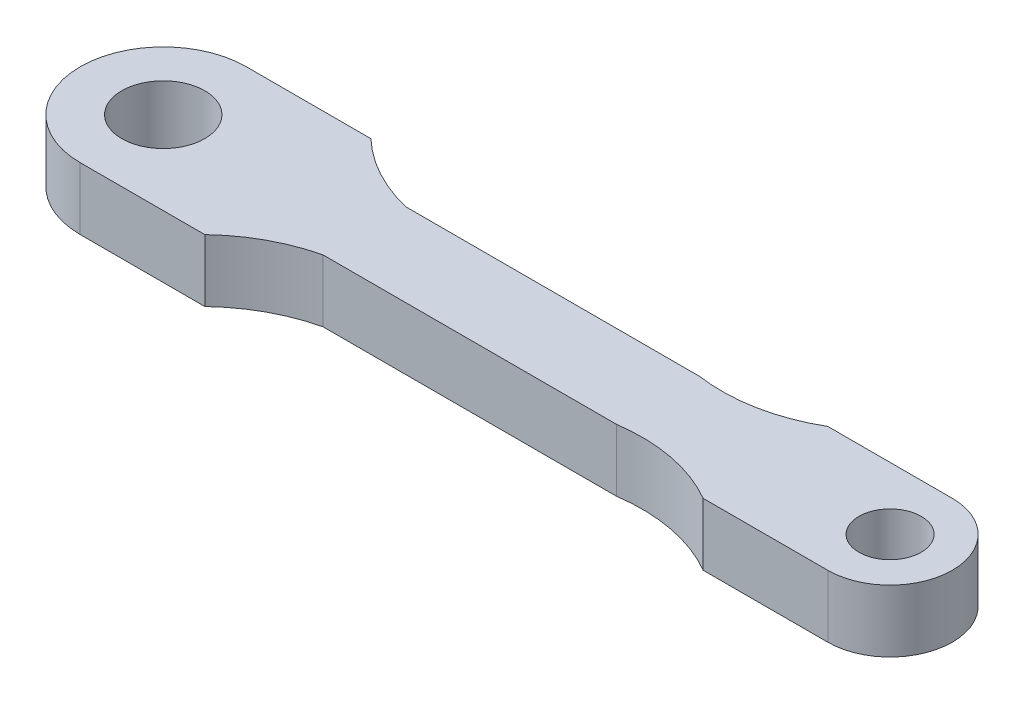
ISO-10303-21;
HEADER;
FILE_DESCRIPTION(('STEP AP214'),'2;1');
FILE_NAME('part.step','',(''),(''),'','','');
FILE_SCHEMA(('AUTOMOTIVE_DESIGN { 1 0 10303 214 1 1 1 1 }'));
ENDSEC;
DATA;
#1=APPLICATION_CONTEXT('core data for automotive mechanical design processes');
#2=APPLICATION_PROTOCOL_DEFINITION('international standard','automotive_design',2000,#1);
#3=PRODUCT_CONTEXT('',#1,'mechanical');
#4=PRODUCT('Part','Part','',(#3));
#5=PRODUCT_RELATED_PRODUCT_CATEGORY('part','',(#4));
#6=PRODUCT_DEFINITION_FORMATION('','',#4);
#7=PRODUCT_DEFINITION_CONTEXT('part definition',#1,'design');
#8=PRODUCT_DEFINITION('design','',#6,#7);
#9=PRODUCT_DEFINITION_SHAPE('','',#8);
#10=(LENGTH_UNIT() NAMED_UNIT(*) SI_UNIT(.MILLI.,.METRE.));
#11=(NAMED_UNIT(*) PLANE_ANGLE_UNIT() SI_UNIT($,.RADIAN.));
#12=(NAMED_UNIT(*) SI_UNIT($,.STERADIAN.) SOLID_ANGLE_UNIT());
#13=UNCERTAINTY_MEASURE_WITH_UNIT(LENGTH_MEASURE(1.E-05),#10,'distance_accuracy_value','');
#14=(GEOMETRIC_REPRESENTATION_CONTEXT(3) GLOBAL_UNCERTAINTY_ASSIGNED_CONTEXT((#13)) GLOBAL_UNIT_ASSIGNED_CONTEXT((#10,
#11,#12)) REPRESENTATION_CONTEXT('',''));
#15=CARTESIAN_POINT('',(0.,0.,0.));
#16=DIRECTION('',(0.,0.,1.));
#17=DIRECTION('',(1.,0.,0.));
#18=AXIS2_PLACEMENT_3D('',#15,#16,#17);
#19=CARTESIAN_POINT('',(-17.5,1.5,0.));
#20=DIRECTION('',(0.,1.,0.));
#21=DIRECTION('',(0.,0.,1.));
#22=AXIS2_PLACEMENT_3D('',#19,#20,#21);
#23=PLANE('',#22);
#24=CARTESIAN_POINT('',(17.5,1.5,0.));
#25=DIRECTION('',(0.,1.,0.));
#26=DIRECTION('',(0.,0.,1.));
#27=AXIS2_PLACEMENT_3D('',#24,#25,#26);
#28=CIRCLE('',#27,1.5);
#29=CARTESIAN_POINT('',(17.5,1.5,1.5));
#30=VERTEX_POINT('',#29);
#31=EDGE_CURVE('E162',#30,#30,#28,.T.);
#32=ORIENTED_EDGE('',*,*,#31,.F.);
#33=EDGE_LOOP('',(#32));
#34=FACE_BOUND('',#33,.T.);
#35=CARTESIAN_POINT('',(-17.5,1.5,0.));
#36=DIRECTION('',(0.,1.,0.));
#37=DIRECTION('',(0.,0.,1.));
#38=AXIS2_PLACEMENT_3D('',#35,#36,#37);
#39=CIRCLE('',#38,4.);
#40=CARTESIAN_POINT('',(-17.5,1.5,-4.));
#41=VERTEX_POINT('',#40);
#42=CARTESIAN_POINT('',(-17.5,1.5,4.));
#43=VERTEX_POINT('',#42);
#44=EDGE_CURVE('E181',#41,#43,#39,.T.);
#45=ORIENTED_EDGE('',*,*,#44,.T.);
#46=DIRECTION('',(1.,0.,0.));
#47=VECTOR('',#46,1.);
#48=CARTESIAN_POINT('',(-17.5,1.5,4.));
#49=LINE('',#48,#47);
#50=CARTESIAN_POINT('',(-11.5,1.5,4.));
#51=VERTEX_POINT('',#50);
#52=EDGE_CURVE('E109',#43,#51,#49,.T.);
#53=ORIENTED_EDGE('',*,*,#52,.T.);
#54=CARTESIAN_POINT('',(-5.97725824612509,1.5,9.78786001212941));
#55=DIRECTION('',(0.,-1.,0.));
#56=DIRECTION('',(0.,0.,-1.));
#57=AXIS2_PLACEMENT_3D('',#54,#55,#56);
#58=CIRCLE('',#57,8.);
#59=CARTESIAN_POINT('',(-7.80735016498482,1.5,2.));
#60=VERTEX_POINT('',#59);
#61=EDGE_CURVE('E208',#51,#60,#58,.T.);
#62=ORIENTED_EDGE('',*,*,#61,.T.);
#63=DIRECTION('',(1.,0.,0.));
#64=VECTOR('',#63,1.);
#65=CARTESIAN_POINT('',(-7.80735016498482,1.5,2.));
#66=LINE('',#65,#64);
#67=CARTESIAN_POINT('',(6.32673168128337,1.5,2.));
#68=VERTEX_POINT('',#67);
#69=EDGE_CURVE('E227',#60,#68,#66,.T.);
#70=ORIENTED_EDGE('',*,*,#69,.T.);
#71=CARTESIAN_POINT('',(7.47975122466593,1.5,9.91647307407648));
#72=DIRECTION('',(0.,-1.,0.));
#73=DIRECTION('',(0.,0.,1.));
#74=AXIS2_PLACEMENT_3D('',#71,#72,#73);
#75=CIRCLE('',#74,8.);
#76=CARTESIAN_POINT('',(11.5,1.5,3.));
#77=VERTEX_POINT('',#76);
#78=EDGE_CURVE('E224',#68,#77,#75,.T.);
#79=ORIENTED_EDGE('',*,*,#78,.T.);
#80=DIRECTION('',(1.,0.,0.));
#81=VECTOR('',#80,1.);
#82=CARTESIAN_POINT('',(17.5,1.5,3.));
#83=LINE('',#82,#81);
#84=CARTESIAN_POINT('',(17.5,1.5,3.));
#85=VERTEX_POINT('',#84);
#86=EDGE_CURVE('E226',#77,#85,#83,.T.);
#87=ORIENTED_EDGE('',*,*,#86,.T.);
#88=CARTESIAN_POINT('',(17.5,1.5,0.));
#89=DIRECTION('',(0.,1.,0.));
#90=DIRECTION('',(0.,0.,1.));
#91=AXIS2_PLACEMENT_3D('',#88,#89,#90);
#92=CIRCLE('',#91,3.);
#93=CARTESIAN_POINT('',(17.5,1.5,-3.));
#94=VERTEX_POINT('',#93);
#95=EDGE_CURVE('E229',#85,#94,#92,.T.);
#96=ORIENTED_EDGE('',*,*,#95,.T.);
#97=DIRECTION('',(-1.,0.,0.));
#98=VECTOR('',#97,1.);
#99=CARTESIAN_POINT('',(17.5,1.5,-3.));
#100=LINE('',#99,#98);
#101=CARTESIAN_POINT('',(11.5,1.5,-3.));
#102=VERTEX_POINT('',#101);
#103=EDGE_CURVE('E235',#94,#102,#100,.T.);
#104=ORIENTED_EDGE('',*,*,#103,.T.);
#105=CARTESIAN_POINT('',(7.47975122466593,1.5,-9.91647307407648));
#106=DIRECTION('',(0.,-1.,0.));
#107=DIRECTION('',(0.,0.,-1.));
#108=AXIS2_PLACEMENT_3D('',#105,#106,#107);
#109=CIRCLE('',#108,8.);
#110=CARTESIAN_POINT('',(6.32673168128337,1.5,-2.));
#111=VERTEX_POINT('',#110);
#112=EDGE_CURVE('E140',#102,#111,#109,.T.);
#113=ORIENTED_EDGE('',*,*,#112,.T.);
#114=DIRECTION('',(-1.,0.,0.));
#115=VECTOR('',#114,1.);
#116=CARTESIAN_POINT('',(-7.80735016498482,1.5,-2.));
#117=LINE('',#116,#115);
#118=CARTESIAN_POINT('',(-7.80735016498483,1.5,-2.));
#119=VERTEX_POINT('',#118);
#120=EDGE_CURVE('E134',#111,#119,#117,.T.);
#121=ORIENTED_EDGE('',*,*,#120,.T.);
#122=CARTESIAN_POINT('',(-5.97725824612509,1.5,-9.78786001212941));
#123=DIRECTION('',(0.,-1.,0.));
#124=DIRECTION('',(0.,0.,1.));
#125=AXIS2_PLACEMENT_3D('',#122,#123,#124);
#126=CIRCLE('',#125,8.);
#127=CARTESIAN_POINT('',(-11.5,1.5,-4.));
#128=VERTEX_POINT('',#127);
#129=EDGE_CURVE('E138',#119,#128,#126,.T.);
#130=ORIENTED_EDGE('',*,*,#129,.T.);
#131=DIRECTION('',(-1.,0.,0.));
#132=VECTOR('',#131,1.);
#133=CARTESIAN_POINT('',(-17.5,1.5,-4.));
#134=LINE('',#133,#132);
#135=EDGE_CURVE('E54',#128,#41,#134,.T.);
#136=ORIENTED_EDGE('',*,*,#135,.T.);
#137=EDGE_LOOP('',(#45,#53,#62,#70,#79,#87,#96,#104,#113,#121,#130,#136));
#138=FACE_BOUND('',#137,.T.);
#139=CARTESIAN_POINT('',(-17.5,1.5,0.));
#140=DIRECTION('',(0.,1.,0.));
#141=DIRECTION('',(0.,0.,1.));
#142=AXIS2_PLACEMENT_3D('',#139,#140,#141);
#143=CIRCLE('',#142,2.);
#144=CARTESIAN_POINT('',(-17.5,1.5,2.));
#145=VERTEX_POINT('',#144);
#146=EDGE_CURVE('E277',#145,#145,#143,.T.);
#147=ORIENTED_EDGE('',*,*,#146,.F.);
#148=EDGE_LOOP('',(#147));
#149=FACE_BOUND('',#148,.T.);
#150=ADVANCED_FACE('F37',(#34,#138,#149),#23,.T.);
#151=CARTESIAN_POINT('',(-17.5,-1.5,0.));
#152=DIRECTION('',(0.,1.,0.));
#153=DIRECTION('',(0.,0.,1.));
#154=AXIS2_PLACEMENT_3D('',#151,#152,#153);
#155=PLANE('',#154);
#156=CARTESIAN_POINT('',(-17.5,-1.5,0.));
#157=DIRECTION('',(0.,1.,0.));
#158=DIRECTION('',(0.,0.,1.));
#159=AXIS2_PLACEMENT_3D('',#156,#157,#158);
#160=CIRCLE('',#159,4.);
#161=CARTESIAN_POINT('',(-17.5,-1.5,-4.));
#162=VERTEX_POINT('',#161);
#163=CARTESIAN_POINT('',(-17.5,-1.5,4.));
#164=VERTEX_POINT('',#163);
#165=EDGE_CURVE('E158',#162,#164,#160,.T.);
#166=ORIENTED_EDGE('',*,*,#165,.F.);
#167=DIRECTION('',(-1.,0.,0.));
#168=VECTOR('',#167,1.);
#169=CARTESIAN_POINT('',(-17.5,-1.5,-4.));
#170=LINE('',#169,#168);
#171=CARTESIAN_POINT('',(-11.5,-1.5,-4.));
#172=VERTEX_POINT('',#171);
#173=EDGE_CURVE('E101',#172,#162,#170,.T.);
#174=ORIENTED_EDGE('',*,*,#173,.F.);
#175=CARTESIAN_POINT('',(-5.97725824612509,-1.5,-9.78786001212941));
#176=DIRECTION('',(0.,-1.,0.));
#177=DIRECTION('',(0.,0.,1.));
#178=AXIS2_PLACEMENT_3D('',#175,#176,#177);
#179=CIRCLE('',#178,8.);
#180=CARTESIAN_POINT('',(-7.80735016498483,-1.5,-2.));
#181=VERTEX_POINT('',#180);
#182=EDGE_CURVE('E95',#181,#172,#179,.T.);
#183=ORIENTED_EDGE('',*,*,#182,.F.);
#184=DIRECTION('',(-1.,0.,0.));
#185=VECTOR('',#184,1.);
#186=CARTESIAN_POINT('',(-7.80735016498482,-1.5,-2.));
#187=LINE('',#186,#185);
#188=CARTESIAN_POINT('',(6.32673168128337,-1.5,-2.));
#189=VERTEX_POINT('',#188);
#190=EDGE_CURVE('E148',#189,#181,#187,.T.);
#191=ORIENTED_EDGE('',*,*,#190,.F.);
#192=CARTESIAN_POINT('',(7.47975122466593,-1.5,-9.91647307407648));
#193=DIRECTION('',(0.,-1.,0.));
#194=DIRECTION('',(0.,0.,-1.));
#195=AXIS2_PLACEMENT_3D('',#192,#193,#194);
#196=CIRCLE('',#195,8.);
#197=CARTESIAN_POINT('',(11.5,-1.5,-3.));
#198=VERTEX_POINT('',#197);
#199=EDGE_CURVE('E176',#198,#189,#196,.T.);
#200=ORIENTED_EDGE('',*,*,#199,.F.);
#201=DIRECTION('',(-1.,0.,0.));
#202=VECTOR('',#201,1.);
#203=CARTESIAN_POINT('',(17.5,-1.5,-3.));
#204=LINE('',#203,#202);
#205=CARTESIAN_POINT('',(17.5,-1.5,-3.));
#206=VERTEX_POINT('',#205);
#207=EDGE_CURVE('E174',#206,#198,#204,.T.);
#208=ORIENTED_EDGE('',*,*,#207,.F.);
#209=CARTESIAN_POINT('',(17.5,-1.5,0.));
#210=DIRECTION('',(0.,1.,0.));
#211=DIRECTION('',(0.,0.,1.));
#212=AXIS2_PLACEMENT_3D('',#209,#210,#211);
#213=CIRCLE('',#212,3.);
#214=CARTESIAN_POINT('',(17.5,-1.5,3.));
#215=VERTEX_POINT('',#214);
#216=EDGE_CURVE('E172',#215,#206,#213,.T.);
#217=ORIENTED_EDGE('',*,*,#216,.F.);
#218=DIRECTION('',(1.,0.,0.));
#219=VECTOR('',#218,1.);
#220=CARTESIAN_POINT('',(17.5,-1.5,3.));
#221=LINE('',#220,#219);
#222=CARTESIAN_POINT('',(11.5,-1.5,3.));
#223=VERTEX_POINT('',#222);
#224=EDGE_CURVE('E170',#223,#215,#221,.T.);
#225=ORIENTED_EDGE('',*,*,#224,.F.);
#226=CARTESIAN_POINT('',(7.47975122466593,-1.5,9.91647307407648));
#227=DIRECTION('',(0.,-1.,0.));
#228=DIRECTION('',(0.,0.,1.));
#229=AXIS2_PLACEMENT_3D('',#226,#227,#228);
#230=CIRCLE('',#229,8.);
#231=CARTESIAN_POINT('',(6.32673168128337,-1.5,2.));
#232=VERTEX_POINT('',#231);
#233=EDGE_CURVE('E168',#232,#223,#230,.T.);
#234=ORIENTED_EDGE('',*,*,#233,.F.);
#235=DIRECTION('',(1.,0.,0.));
#236=VECTOR('',#235,1.);
#237=CARTESIAN_POINT('',(-7.80735016498482,-1.5,2.));
#238=LINE('',#237,#236);
#239=CARTESIAN_POINT('',(-7.80735016498482,-1.5,2.));
#240=VERTEX_POINT('',#239);
#241=EDGE_CURVE('E166',#240,#232,#238,.T.);
#242=ORIENTED_EDGE('',*,*,#241,.F.);
#243=CARTESIAN_POINT('',(-5.97725824612509,-1.5,9.78786001212941));
#244=DIRECTION('',(0.,-1.,0.));
#245=DIRECTION('',(0.,0.,-1.));
#246=AXIS2_PLACEMENT_3D('',#243,#244,#245);
#247=CIRCLE('',#246,8.);
#248=CARTESIAN_POINT('',(-11.5,-1.5,4.));
#249=VERTEX_POINT('',#248);
#250=EDGE_CURVE('E164',#249,#240,#247,.T.);
#251=ORIENTED_EDGE('',*,*,#250,.F.);
#252=DIRECTION('',(1.,0.,0.));
#253=VECTOR('',#252,1.);
#254=CARTESIAN_POINT('',(-17.5,-1.5,4.));
#255=LINE('',#254,#253);
#256=EDGE_CURVE('E161',#164,#249,#255,.T.);
#257=ORIENTED_EDGE('',*,*,#256,.F.);
#258=EDGE_LOOP('',(#166,#174,#183,#191,#200,#208,#217,#225,#234,#242,#251,#257));
#259=FACE_BOUND('',#258,.T.);
#260=CARTESIAN_POINT('',(17.5,-1.5,0.));
#261=DIRECTION('',(0.,1.,0.));
#262=DIRECTION('',(0.,0.,1.));
#263=AXIS2_PLACEMENT_3D('',#260,#261,#262);
#264=CIRCLE('',#263,1.5);
#265=CARTESIAN_POINT('',(17.5,-1.5,1.5));
#266=VERTEX_POINT('',#265);
#267=EDGE_CURVE('E283',#266,#266,#264,.T.);
#268=ORIENTED_EDGE('',*,*,#267,.T.);
#269=EDGE_LOOP('',(#268));
#270=FACE_BOUND('',#269,.T.);
#271=CARTESIAN_POINT('',(-17.5,-1.5,0.));
#272=DIRECTION('',(0.,1.,0.));
#273=DIRECTION('',(0.,0.,1.));
#274=AXIS2_PLACEMENT_3D('',#271,#272,#273);
#275=CIRCLE('',#274,2.);
#276=CARTESIAN_POINT('',(-17.5,-1.5,2.));
#277=VERTEX_POINT('',#276);
#278=EDGE_CURVE('E280',#277,#277,#275,.T.);
#279=ORIENTED_EDGE('',*,*,#278,.T.);
#280=EDGE_LOOP('',(#279));
#281=FACE_BOUND('',#280,.T.);
#282=ADVANCED_FACE('F212',(#259,#270,#281),#155,.F.);
#283=CARTESIAN_POINT('',(-17.5,1.5,0.));
#284=DIRECTION('',(0.,-1.,0.));
#285=DIRECTION('',(0.,0.,-1.));
#286=AXIS2_PLACEMENT_3D('',#283,#284,#285);
#287=CYLINDRICAL_SURFACE('',#286,4.);
#288=ORIENTED_EDGE('',*,*,#165,.T.);
#289=DIRECTION('',(0.,-1.,0.));
#290=VECTOR('',#289,1.);
#291=CARTESIAN_POINT('',(-17.5,1.5,4.));
#292=LINE('',#291,#290);
#293=EDGE_CURVE('E11',#43,#164,#292,.T.);
#294=ORIENTED_EDGE('',*,*,#293,.F.);
#295=ORIENTED_EDGE('',*,*,#44,.F.);
#296=DIRECTION('',(0.,-1.,0.));
#297=VECTOR('',#296,1.);
#298=CARTESIAN_POINT('',(-17.5,1.5,-4.));
#299=LINE('',#298,#297);
#300=EDGE_CURVE('E154',#41,#162,#299,.T.);
#301=ORIENTED_EDGE('',*,*,#300,.T.);
#302=EDGE_LOOP('',(#288,#294,#295,#301));
#303=FACE_BOUND('',#302,.T.);
#304=ADVANCED_FACE('F39',(#303),#287,.T.);
#305=CARTESIAN_POINT('',(-17.5,1.5,4.));
#306=DIRECTION('',(0.,0.,-1.));
#307=DIRECTION('',(-1.,0.,0.));
#308=AXIS2_PLACEMENT_3D('',#305,#306,#307);
#309=PLANE('',#308);
#310=ORIENTED_EDGE('',*,*,#256,.T.);
#311=DIRECTION('',(0.,-1.,0.));
#312=VECTOR('',#311,1.);
#313=CARTESIAN_POINT('',(-11.5,1.5,4.));
#314=LINE('',#313,#312);
#315=EDGE_CURVE('E46',#51,#249,#314,.T.);
#316=ORIENTED_EDGE('',*,*,#315,.F.);
#317=ORIENTED_EDGE('',*,*,#52,.F.);
#318=ORIENTED_EDGE('',*,*,#293,.T.);
#319=EDGE_LOOP('',(#310,#316,#317,#318));
#320=FACE_BOUND('',#319,.T.);
#321=ADVANCED_FACE('F386',(#320),#309,.F.);
#322=CARTESIAN_POINT('',(-5.97725824612509,1.5,9.78786001212941));
#323=DIRECTION('',(0.,-1.,0.));
#324=DIRECTION('',(0.,0.,-1.));
#325=AXIS2_PLACEMENT_3D('',#322,#323,#324);
#326=CYLINDRICAL_SURFACE('',#325,8.);
#327=ORIENTED_EDGE('',*,*,#250,.T.);
#328=DIRECTION('',(0.,-1.,0.));
#329=VECTOR('',#328,1.);
#330=CARTESIAN_POINT('',(-7.80735016498482,1.5,2.));
#331=LINE('',#330,#329);
#332=EDGE_CURVE('E200',#60,#240,#331,.T.);
#333=ORIENTED_EDGE('',*,*,#332,.F.);
#334=ORIENTED_EDGE('',*,*,#61,.F.);
#335=ORIENTED_EDGE('',*,*,#315,.T.);
#336=EDGE_LOOP('',(#327,#333,#334,#335));
#337=FACE_BOUND('',#336,.T.);
#338=ADVANCED_FACE('F206',(#337),#326,.F.);
#339=CARTESIAN_POINT('',(-7.80735016498482,1.5,2.));
#340=DIRECTION('',(0.,0.,-1.));
#341=DIRECTION('',(-1.,0.,0.));
#342=AXIS2_PLACEMENT_3D('',#339,#340,#341);
#343=PLANE('',#342);
#344=ORIENTED_EDGE('',*,*,#241,.T.);
#345=DIRECTION('',(0.,-1.,0.));
#346=VECTOR('',#345,1.);
#347=CARTESIAN_POINT('',(6.32673168128337,1.5,2.));
#348=LINE('',#347,#346);
#349=EDGE_CURVE('E197',#68,#232,#348,.T.);
#350=ORIENTED_EDGE('',*,*,#349,.F.);
#351=ORIENTED_EDGE('',*,*,#69,.F.);
#352=ORIENTED_EDGE('',*,*,#332,.T.);
#353=EDGE_LOOP('',(#344,#350,#351,#352));
#354=FACE_BOUND('',#353,.T.);
#355=ADVANCED_FACE('F218',(#354),#343,.F.);
#356=CARTESIAN_POINT('',(7.47975122466593,1.5,9.91647307407648));
#357=DIRECTION('',(0.,-1.,0.));
#358=DIRECTION('',(0.,0.,-1.));
#359=AXIS2_PLACEMENT_3D('',#356,#357,#358);
#360=CYLINDRICAL_SURFACE('',#359,8.);
#361=ORIENTED_EDGE('',*,*,#233,.T.);
#362=DIRECTION('',(0.,-1.,0.));
#363=VECTOR('',#362,1.);
#364=CARTESIAN_POINT('',(11.5,1.5,3.));
#365=LINE('',#364,#363);
#366=EDGE_CURVE('E194',#77,#223,#365,.T.);
#367=ORIENTED_EDGE('',*,*,#366,.F.);
#368=ORIENTED_EDGE('',*,*,#78,.F.);
#369=ORIENTED_EDGE('',*,*,#349,.T.);
#370=EDGE_LOOP('',(#361,#367,#368,#369));
#371=FACE_BOUND('',#370,.T.);
#372=ADVANCED_FACE('F222',(#371),#360,.F.);
#373=CARTESIAN_POINT('',(17.5,1.5,3.));
#374=DIRECTION('',(0.,0.,-1.));
#375=DIRECTION('',(-1.,0.,0.));
#376=AXIS2_PLACEMENT_3D('',#373,#374,#375);
#377=PLANE('',#376);
#378=ORIENTED_EDGE('',*,*,#224,.T.);
#379=DIRECTION('',(0.,-1.,0.));
#380=VECTOR('',#379,1.);
#381=CARTESIAN_POINT('',(17.5,1.5,3.));
#382=LINE('',#381,#380);
#383=EDGE_CURVE('E191',#85,#215,#382,.T.);
#384=ORIENTED_EDGE('',*,*,#383,.F.);
#385=ORIENTED_EDGE('',*,*,#86,.F.);
#386=ORIENTED_EDGE('',*,*,#366,.T.);
#387=EDGE_LOOP('',(#378,#384,#385,#386));
#388=FACE_BOUND('',#387,.T.);
#389=ADVANCED_FACE('F347',(#388),#377,.F.);
#390=CARTESIAN_POINT('',(17.5,1.5,0.));
#391=DIRECTION('',(0.,-1.,0.));
#392=DIRECTION('',(0.,0.,-1.));
#393=AXIS2_PLACEMENT_3D('',#390,#391,#392);
#394=CYLINDRICAL_SURFACE('',#393,3.);
#395=ORIENTED_EDGE('',*,*,#216,.T.);
#396=DIRECTION('',(0.,-1.,0.));
#397=VECTOR('',#396,1.);
#398=CARTESIAN_POINT('',(17.5,1.5,-3.));
#399=LINE('',#398,#397);
#400=EDGE_CURVE('E188',#94,#206,#399,.T.);
#401=ORIENTED_EDGE('',*,*,#400,.F.);
#402=ORIENTED_EDGE('',*,*,#95,.F.);
#403=ORIENTED_EDGE('',*,*,#383,.T.);
#404=EDGE_LOOP('',(#395,#401,#402,#403));
#405=FACE_BOUND('',#404,.T.);
#406=ADVANCED_FACE('F337',(#405),#394,.T.);
#407=CARTESIAN_POINT('',(17.5,1.5,-3.));
#408=DIRECTION('',(0.,0.,1.));
#409=DIRECTION('',(1.,0.,0.));
#410=AXIS2_PLACEMENT_3D('',#407,#408,#409);
#411=PLANE('',#410);
#412=ORIENTED_EDGE('',*,*,#207,.T.);
#413=DIRECTION('',(0.,-1.,0.));
#414=VECTOR('',#413,1.);
#415=CARTESIAN_POINT('',(11.5,1.5,-3.));
#416=LINE('',#415,#414);
#417=EDGE_CURVE('E185',#102,#198,#416,.T.);
#418=ORIENTED_EDGE('',*,*,#417,.F.);
#419=ORIENTED_EDGE('',*,*,#103,.F.);
#420=ORIENTED_EDGE('',*,*,#400,.T.);
#421=EDGE_LOOP('',(#412,#418,#419,#420));
#422=FACE_BOUND('',#421,.T.);
#423=ADVANCED_FACE('F241',(#422),#411,.F.);
#424=CARTESIAN_POINT('',(7.47975122466593,1.5,-9.91647307407648));
#425=DIRECTION('',(0.,-1.,0.));
#426=DIRECTION('',(0.,0.,-1.));
#427=AXIS2_PLACEMENT_3D('',#424,#425,#426);
#428=CYLINDRICAL_SURFACE('',#427,8.);
#429=ORIENTED_EDGE('',*,*,#199,.T.);
#430=DIRECTION('',(0.,-1.,0.));
#431=VECTOR('',#430,1.);
#432=CARTESIAN_POINT('',(6.32673168128337,1.5,-2.));
#433=LINE('',#432,#431);
#434=EDGE_CURVE('E149',#111,#189,#433,.T.);
#435=ORIENTED_EDGE('',*,*,#434,.F.);
#436=ORIENTED_EDGE('',*,*,#112,.F.);
#437=ORIENTED_EDGE('',*,*,#417,.T.);
#438=EDGE_LOOP('',(#429,#435,#436,#437));
#439=FACE_BOUND('',#438,.T.);
#440=ADVANCED_FACE('F245',(#439),#428,.F.);
#441=CARTESIAN_POINT('',(-7.80735016498482,1.5,-2.));
#442=DIRECTION('',(0.,0.,1.));
#443=DIRECTION('',(1.,0.,0.));
#444=AXIS2_PLACEMENT_3D('',#441,#442,#443);
#445=PLANE('',#444);
#446=ORIENTED_EDGE('',*,*,#190,.T.);
#447=DIRECTION('',(0.,-1.,0.));
#448=VECTOR('',#447,1.);
#449=CARTESIAN_POINT('',(-7.80735016498483,1.5,-2.));
#450=LINE('',#449,#448);
#451=EDGE_CURVE('E145',#119,#181,#450,.T.);
#452=ORIENTED_EDGE('',*,*,#451,.F.);
#453=ORIENTED_EDGE('',*,*,#120,.F.);
#454=ORIENTED_EDGE('',*,*,#434,.T.);
#455=EDGE_LOOP('',(#446,#452,#453,#454));
#456=FACE_BOUND('',#455,.T.);
#457=ADVANCED_FACE('F146',(#456),#445,.F.);
#458=CARTESIAN_POINT('',(-5.97725824612509,1.5,-9.78786001212941));
#459=DIRECTION('',(0.,-1.,0.));
#460=DIRECTION('',(0.,0.,-1.));
#461=AXIS2_PLACEMENT_3D('',#458,#459,#460);
#462=CYLINDRICAL_SURFACE('',#461,8.);
#463=ORIENTED_EDGE('',*,*,#182,.T.);
#464=DIRECTION('',(0.,-1.,0.));
#465=VECTOR('',#464,1.);
#466=CARTESIAN_POINT('',(-11.5,1.5,-4.));
#467=LINE('',#466,#465);
#468=EDGE_CURVE('E150',#128,#172,#467,.T.);
#469=ORIENTED_EDGE('',*,*,#468,.F.);
#470=ORIENTED_EDGE('',*,*,#129,.F.);
#471=ORIENTED_EDGE('',*,*,#451,.T.);
#472=EDGE_LOOP('',(#463,#469,#470,#471));
#473=FACE_BOUND('',#472,.T.);
#474=ADVANCED_FACE('F152',(#473),#462,.F.);
#475=CARTESIAN_POINT('',(-17.5,1.5,-4.));
#476=DIRECTION('',(0.,0.,1.));
#477=DIRECTION('',(1.,0.,0.));
#478=AXIS2_PLACEMENT_3D('',#475,#476,#477);
#479=PLANE('',#478);
#480=ORIENTED_EDGE('',*,*,#173,.T.);
#481=ORIENTED_EDGE('',*,*,#300,.F.);
#482=ORIENTED_EDGE('',*,*,#135,.F.);
#483=ORIENTED_EDGE('',*,*,#468,.T.);
#484=EDGE_LOOP('',(#480,#481,#482,#483));
#485=FACE_BOUND('',#484,.T.);
#486=ADVANCED_FACE('F249',(#485),#479,.F.);
#487=CARTESIAN_POINT('',(17.5,1.5,0.));
#488=DIRECTION('',(0.,-1.,0.));
#489=DIRECTION('',(0.,0.,-1.));
#490=AXIS2_PLACEMENT_3D('',#487,#488,#489);
#491=CYLINDRICAL_SURFACE('',#490,1.5);
#492=ORIENTED_EDGE('',*,*,#31,.T.);
#493=EDGE_LOOP('',(#492));
#494=FACE_BOUND('',#493,.T.);
#495=ORIENTED_EDGE('',*,*,#267,.F.);
#496=EDGE_LOOP('',(#495));
#497=FACE_BOUND('',#496,.T.);
#498=ADVANCED_FACE('F251',(#494,#497),#491,.F.);
#499=CARTESIAN_POINT('',(-17.5,1.5,0.));
#500=DIRECTION('',(0.,-1.,0.));
#501=DIRECTION('',(0.,0.,-1.));
#502=AXIS2_PLACEMENT_3D('',#499,#500,#501);
#503=CYLINDRICAL_SURFACE('',#502,2.);
#504=ORIENTED_EDGE('',*,*,#146,.T.);
#505=EDGE_LOOP('',(#504));
#506=FACE_BOUND('',#505,.T.);
#507=ORIENTED_EDGE('',*,*,#278,.F.);
#508=EDGE_LOOP('',(#507));
#509=FACE_BOUND('',#508,.T.);
#510=ADVANCED_FACE('F257',(#506,#509),#503,.F.);
#511=CLOSED_SHELL('',(#150,#282,#304,#321,#338,#355,#372,#389,#406,#423,#440,#457,#474,#486,
#498,#510));
#512=MANIFOLD_SOLID_BREP('B2',#511);
#513=ADVANCED_BREP_SHAPE_REPRESENTATION('',(#18,#512),#14);
#514=SHAPE_DEFINITION_REPRESENTATION(#9,#513);
ENDSEC;
END-ISO-10303-21;
